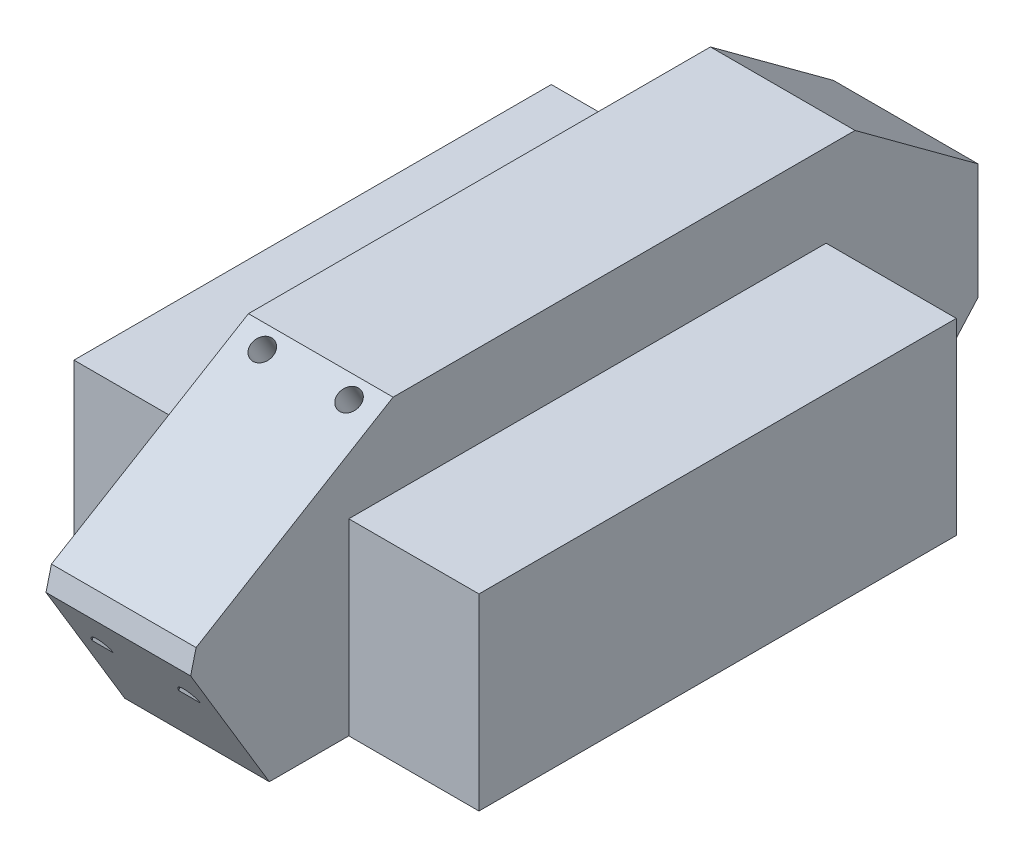
ISO-10303-21;
HEADER;
FILE_DESCRIPTION(('STEP AP214'),'2;1');
FILE_NAME('part.step','',(''),(''),'','','');
FILE_SCHEMA(('AUTOMOTIVE_DESIGN { 1 0 10303 214 1 1 1 1 }'));
ENDSEC;
DATA;
#1=APPLICATION_CONTEXT('core data for automotive mechanical design processes');
#2=APPLICATION_PROTOCOL_DEFINITION('international standard','automotive_design',2000,#1);
#3=PRODUCT_CONTEXT('',#1,'mechanical');
#4=PRODUCT('Part','Part','',(#3));
#5=PRODUCT_RELATED_PRODUCT_CATEGORY('part','',(#4));
#6=PRODUCT_DEFINITION_FORMATION('','',#4);
#7=PRODUCT_DEFINITION_CONTEXT('part definition',#1,'design');
#8=PRODUCT_DEFINITION('design','',#6,#7);
#9=PRODUCT_DEFINITION_SHAPE('','',#8);
#10=(LENGTH_UNIT() NAMED_UNIT(*) SI_UNIT(.MILLI.,.METRE.));
#11=(NAMED_UNIT(*) PLANE_ANGLE_UNIT() SI_UNIT($,.RADIAN.));
#12=(NAMED_UNIT(*) SI_UNIT($,.STERADIAN.) SOLID_ANGLE_UNIT());
#13=UNCERTAINTY_MEASURE_WITH_UNIT(LENGTH_MEASURE(1.E-05),#10,'distance_accuracy_value','');
#14=(GEOMETRIC_REPRESENTATION_CONTEXT(3) GLOBAL_UNCERTAINTY_ASSIGNED_CONTEXT((#13)) GLOBAL_UNIT_ASSIGNED_CONTEXT((#10,
#11,#12)) REPRESENTATION_CONTEXT('',''));
#15=CARTESIAN_POINT('',(0.,0.,0.));
#16=DIRECTION('',(0.,0.,1.));
#17=DIRECTION('',(1.,0.,0.));
#18=AXIS2_PLACEMENT_3D('',#15,#16,#17);
#19=CARTESIAN_POINT('',(-10.,38.,55.));
#20=DIRECTION('',(1.,0.,0.));
#21=DIRECTION('',(0.,0.,-1.));
#22=AXIS2_PLACEMENT_3D('',#19,#20,#21);
#23=PLANE('',#22);
#24=DIRECTION('',(0.,0.857167300702112,0.515038074910055));
#25=VECTOR('',#24,1.);
#26=CARTESIAN_POINT('',(-10.,33.225244065073,62.9465283357303));
#27=LINE('',#26,#25);
#28=CARTESIAN_POINT('',(-10.,0.,42.9827876194488));
#29=VERTEX_POINT('',#28);
#30=CARTESIAN_POINT('',(-10.,18.1142319384553,53.8669162351978));
#31=VERTEX_POINT('',#30);
#32=EDGE_CURVE('E162',#29,#31,#27,.T.);
#33=ORIENTED_EDGE('',*,*,#32,.T.);
#34=DIRECTION('',(0.,0.970295726275997,-0.241921895599667));
#35=VECTOR('',#34,1.);
#36=CARTESIAN_POINT('',(-10.,21.1330837648021,53.1142319384553));
#37=LINE('',#36,#35);
#38=CARTESIAN_POINT('',(-10.,21.1330837648021,53.1142319384553));
#39=VERTEX_POINT('',#38);
#40=EDGE_CURVE('E12',#31,#39,#37,.T.);
#41=ORIENTED_EDGE('',*,*,#40,.T.);
#42=DIRECTION('',(0.,0.515038074910052,-0.857167300702114));
#43=VECTOR('',#42,1.);
#44=CARTESIAN_POINT('',(-10.,38.9757744314794,23.4190079519771));
#45=LINE('',#44,#43);
#46=CARTESIAN_POINT('',(-10.,37.5,25.8751090588658));
#47=VERTEX_POINT('',#46);
#48=EDGE_CURVE('E209',#39,#47,#45,.T.);
#49=ORIENTED_EDGE('',*,*,#48,.T.);
#50=DIRECTION('',(0.,0.,-1.));
#51=VECTOR('',#50,1.);
#52=CARTESIAN_POINT('',(-10.,37.5,55.));
#53=LINE('',#52,#51);
#54=CARTESIAN_POINT('',(-10.,37.5,-38.));
#55=VERTEX_POINT('',#54);
#56=EDGE_CURVE('E334',#47,#55,#53,.T.);
#57=ORIENTED_EDGE('',*,*,#56,.T.);
#58=DIRECTION('',(0.,0.592390450477519,0.805651012649424));
#59=VECTOR('',#58,1.);
#60=CARTESIAN_POINT('',(-10.,82.0606400898372,22.6024705221784));
#61=LINE('',#60,#59);
#62=CARTESIAN_POINT('',(-10.,25.,-55.));
#63=VERTEX_POINT('',#62);
#64=EDGE_CURVE('E310',#63,#55,#61,.T.);
#65=ORIENTED_EDGE('',*,*,#64,.F.);
#66=DIRECTION('',(0.,-1.,0.));
#67=VECTOR('',#66,1.);
#68=CARTESIAN_POINT('',(-10.,38.,-55.));
#69=LINE('',#68,#67);
#70=CARTESIAN_POINT('',(-10.,9.,-55.));
#71=VERTEX_POINT('',#70);
#72=EDGE_CURVE('E177',#63,#71,#69,.T.);
#73=ORIENTED_EDGE('',*,*,#72,.T.);
#74=DIRECTION('',(0.,-0.74740931868366,0.66436383882992));
#75=VECTOR('',#74,1.);
#76=CARTESIAN_POINT('',(-10.,-29.4206896551724,-20.848275862069));
#77=LINE('',#76,#75);
#78=CARTESIAN_POINT('',(-10.,0.,-47.));
#79=VERTEX_POINT('',#78);
#80=EDGE_CURVE('E313',#71,#79,#77,.T.);
#81=ORIENTED_EDGE('',*,*,#80,.T.);
#82=DIRECTION('',(0.,0.,1.));
#83=VECTOR('',#82,1.);
#84=CARTESIAN_POINT('',(-10.,0.,55.));
#85=LINE('',#84,#83);
#86=CARTESIAN_POINT('',(-10.,0.,-34.));
#87=VERTEX_POINT('',#86);
#88=EDGE_CURVE('E184',#79,#87,#85,.T.);
#89=ORIENTED_EDGE('',*,*,#88,.T.);
#90=DIRECTION('',(0.,-1.,0.));
#91=VECTOR('',#90,1.);
#92=CARTESIAN_POINT('',(-10.,26.,-34.));
#93=LINE('',#92,#91);
#94=CARTESIAN_POINT('',(-10.,26.,-34.));
#95=VERTEX_POINT('',#94);
#96=EDGE_CURVE('E218',#95,#87,#93,.T.);
#97=ORIENTED_EDGE('',*,*,#96,.F.);
#98=DIRECTION('',(0.,0.,-1.));
#99=VECTOR('',#98,1.);
#100=CARTESIAN_POINT('',(-10.,26.,86.6227766016838));
#101=LINE('',#100,#99);
#102=CARTESIAN_POINT('',(-10.,26.,32.));
#103=VERTEX_POINT('',#102);
#104=EDGE_CURVE('E248',#103,#95,#101,.T.);
#105=ORIENTED_EDGE('',*,*,#104,.F.);
#106=DIRECTION('',(0.,-1.,0.));
#107=VECTOR('',#106,1.);
#108=CARTESIAN_POINT('',(-10.,26.,32.));
#109=LINE('',#108,#107);
#110=CARTESIAN_POINT('',(-10.,0.,32.));
#111=VERTEX_POINT('',#110);
#112=EDGE_CURVE('E237',#103,#111,#109,.T.);
#113=ORIENTED_EDGE('',*,*,#112,.T.);
#114=EDGE_CURVE('E274',#111,#29,#85,.T.);
#115=ORIENTED_EDGE('',*,*,#114,.T.);
#116=EDGE_LOOP('',(#33,#41,#49,#57,#65,#73,#81,#89,#97,#105,#113,#115));
#117=FACE_BOUND('',#116,.T.);
#118=ADVANCED_FACE('F37',(#117),#23,.F.);
#119=CARTESIAN_POINT('',(10.,38.,55.));
#120=DIRECTION('',(-1.,0.,0.));
#121=DIRECTION('',(0.,0.,1.));
#122=AXIS2_PLACEMENT_3D('',#119,#120,#121);
#123=PLANE('',#122);
#124=DIRECTION('',(0.,-0.515038074910052,0.857167300702114));
#125=VECTOR('',#124,1.);
#126=CARTESIAN_POINT('',(10.,38.9757744314794,23.4190079519771));
#127=LINE('',#126,#125);
#128=CARTESIAN_POINT('',(10.,37.5,25.8751090588657));
#129=VERTEX_POINT('',#128);
#130=CARTESIAN_POINT('',(10.,21.1330837648021,53.1142319384553));
#131=VERTEX_POINT('',#130);
#132=EDGE_CURVE('E208',#129,#131,#127,.T.);
#133=ORIENTED_EDGE('',*,*,#132,.T.);
#134=DIRECTION('',(0.,-0.970295726275997,0.241921895599667));
#135=VECTOR('',#134,1.);
#136=CARTESIAN_POINT('',(10.,21.1330837648021,53.1142319384553));
#137=LINE('',#136,#135);
#138=CARTESIAN_POINT('',(10.,18.1142319384553,53.8669162351979));
#139=VERTEX_POINT('',#138);
#140=EDGE_CURVE('E59',#131,#139,#137,.T.);
#141=ORIENTED_EDGE('',*,*,#140,.T.);
#142=DIRECTION('',(0.,0.857167300702112,0.515038074910055));
#143=VECTOR('',#142,1.);
#144=CARTESIAN_POINT('',(10.,20.,55.));
#145=LINE('',#144,#143);
#146=CARTESIAN_POINT('',(10.,0.,42.9827876194488));
#147=VERTEX_POINT('',#146);
#148=EDGE_CURVE('E161',#147,#139,#145,.T.);
#149=ORIENTED_EDGE('',*,*,#148,.F.);
#150=DIRECTION('',(0.,0.,-1.));
#151=VECTOR('',#150,1.);
#152=CARTESIAN_POINT('',(10.,0.,55.));
#153=LINE('',#152,#151);
#154=CARTESIAN_POINT('',(10.,0.,32.));
#155=VERTEX_POINT('',#154);
#156=EDGE_CURVE('E170',#147,#155,#153,.T.);
#157=ORIENTED_EDGE('',*,*,#156,.T.);
#158=DIRECTION('',(0.,1.,0.));
#159=VECTOR('',#158,1.);
#160=CARTESIAN_POINT('',(10.,26.,32.));
#161=LINE('',#160,#159);
#162=CARTESIAN_POINT('',(10.,26.,32.));
#163=VERTEX_POINT('',#162);
#164=EDGE_CURVE('E268',#155,#163,#161,.T.);
#165=ORIENTED_EDGE('',*,*,#164,.T.);
#166=DIRECTION('',(0.,0.,-1.));
#167=VECTOR('',#166,1.);
#168=CARTESIAN_POINT('',(10.,26.,86.6227766016838));
#169=LINE('',#168,#167);
#170=CARTESIAN_POINT('',(10.,26.,-34.));
#171=VERTEX_POINT('',#170);
#172=EDGE_CURVE('E278',#163,#171,#169,.T.);
#173=ORIENTED_EDGE('',*,*,#172,.T.);
#174=DIRECTION('',(0.,1.,0.));
#175=VECTOR('',#174,1.);
#176=CARTESIAN_POINT('',(10.,26.,-34.));
#177=LINE('',#176,#175);
#178=CARTESIAN_POINT('',(10.,0.,-34.));
#179=VERTEX_POINT('',#178);
#180=EDGE_CURVE('E263',#179,#171,#177,.T.);
#181=ORIENTED_EDGE('',*,*,#180,.F.);
#182=CARTESIAN_POINT('',(10.,0.,-47.));
#183=VERTEX_POINT('',#182);
#184=EDGE_CURVE('E178',#179,#183,#153,.T.);
#185=ORIENTED_EDGE('',*,*,#184,.T.);
#186=DIRECTION('',(0.,-0.74740931868366,0.66436383882992));
#187=VECTOR('',#186,1.);
#188=CARTESIAN_POINT('',(10.,-23.3379310344828,-26.2551724137931));
#189=LINE('',#188,#187);
#190=CARTESIAN_POINT('',(10.,9.,-55.));
#191=VERTEX_POINT('',#190);
#192=EDGE_CURVE('E298',#191,#183,#189,.T.);
#193=ORIENTED_EDGE('',*,*,#192,.F.);
#194=DIRECTION('',(0.,-1.,0.));
#195=VECTOR('',#194,1.);
#196=CARTESIAN_POINT('',(10.,38.,-55.));
#197=LINE('',#196,#195);
#198=CARTESIAN_POINT('',(10.,25.,-55.));
#199=VERTEX_POINT('',#198);
#200=EDGE_CURVE('E181',#199,#191,#197,.T.);
#201=ORIENTED_EDGE('',*,*,#200,.F.);
#202=DIRECTION('',(0.,0.592390450477519,0.805651012649424));
#203=VECTOR('',#202,1.);
#204=CARTESIAN_POINT('',(10.,42.4761370016844,-31.2324536777092));
#205=LINE('',#204,#203);
#206=CARTESIAN_POINT('',(10.,37.5,-38.));
#207=VERTEX_POINT('',#206);
#208=EDGE_CURVE('E311',#199,#207,#205,.T.);
#209=ORIENTED_EDGE('',*,*,#208,.T.);
#210=DIRECTION('',(0.,0.,-1.));
#211=VECTOR('',#210,1.);
#212=CARTESIAN_POINT('',(10.,37.5,-58.4735309930156));
#213=LINE('',#212,#211);
#214=EDGE_CURVE('E215',#129,#207,#213,.T.);
#215=ORIENTED_EDGE('',*,*,#214,.F.);
#216=EDGE_LOOP('',(#133,#141,#149,#157,#165,#173,#181,#185,#193,#201,#209,#215));
#217=FACE_BOUND('',#216,.T.);
#218=ADVANCED_FACE('F169',(#217),#123,.F.);
#219=CARTESIAN_POINT('',(10.,38.,-55.));
#220=DIRECTION('',(0.,0.,1.));
#221=DIRECTION('',(1.,0.,0.));
#222=AXIS2_PLACEMENT_3D('',#219,#220,#221);
#223=PLANE('',#222);
#224=DIRECTION('',(1.,0.,0.));
#225=VECTOR('',#224,1.);
#226=CARTESIAN_POINT('',(-28.,25.,-55.));
#227=LINE('',#226,#225);
#228=EDGE_CURVE('E307',#63,#199,#227,.T.);
#229=ORIENTED_EDGE('',*,*,#228,.T.);
#230=ORIENTED_EDGE('',*,*,#200,.T.);
#231=DIRECTION('',(1.,0.,0.));
#232=VECTOR('',#231,1.);
#233=CARTESIAN_POINT('',(-28.,9.,-55.));
#234=LINE('',#233,#232);
#235=EDGE_CURVE('E300',#71,#191,#234,.T.);
#236=ORIENTED_EDGE('',*,*,#235,.F.);
#237=ORIENTED_EDGE('',*,*,#72,.F.);
#238=EDGE_LOOP('',(#229,#230,#236,#237));
#239=FACE_BOUND('',#238,.T.);
#240=ADVANCED_FACE('F305',(#239),#223,.F.);
#241=CARTESIAN_POINT('',(-28.,37.5,-58.4735309930156));
#242=DIRECTION('',(0.,-1.,0.));
#243=DIRECTION('',(0.,0.,-1.));
#244=AXIS2_PLACEMENT_3D('',#241,#242,#243);
#245=PLANE('',#244);
#246=DIRECTION('',(1.,0.,0.));
#247=VECTOR('',#246,1.);
#248=CARTESIAN_POINT('',(-28.,37.5,-38.));
#249=LINE('',#248,#247);
#250=EDGE_CURVE('E192',#55,#207,#249,.T.);
#251=ORIENTED_EDGE('',*,*,#250,.F.);
#252=ORIENTED_EDGE('',*,*,#56,.F.);
#253=DIRECTION('',(1.,0.,0.));
#254=VECTOR('',#253,1.);
#255=CARTESIAN_POINT('',(-44.9488724753866,37.5,25.8751090588658));
#256=LINE('',#255,#254);
#257=EDGE_CURVE('E190',#47,#129,#256,.T.);
#258=ORIENTED_EDGE('',*,*,#257,.T.);
#259=ORIENTED_EDGE('',*,*,#214,.T.);
#260=EDGE_LOOP('',(#251,#252,#258,#259));
#261=FACE_BOUND('',#260,.T.);
#262=ADVANCED_FACE('F378',(#261),#245,.F.);
#263=CARTESIAN_POINT('',(0.,0.,0.));
#264=DIRECTION('',(0.,1.,0.));
#265=DIRECTION('',(0.,0.,1.));
#266=AXIS2_PLACEMENT_3D('',#263,#264,#265);
#267=PLANE('',#266);
#268=ORIENTED_EDGE('',*,*,#156,.F.);
#269=DIRECTION('',(1.,0.,0.));
#270=VECTOR('',#269,1.);
#271=CARTESIAN_POINT('',(-28.,0.,42.9827876194488));
#272=LINE('',#271,#270);
#273=EDGE_CURVE('E159',#29,#147,#272,.T.);
#274=ORIENTED_EDGE('',*,*,#273,.F.);
#275=ORIENTED_EDGE('',*,*,#114,.F.);
#276=DIRECTION('',(-1.,0.,0.));
#277=VECTOR('',#276,1.);
#278=CARTESIAN_POINT('',(-28.,0.,32.));
#279=LINE('',#278,#277);
#280=CARTESIAN_POINT('',(-28.,0.,32.));
#281=VERTEX_POINT('',#280);
#282=EDGE_CURVE('E239',#111,#281,#279,.T.);
#283=ORIENTED_EDGE('',*,*,#282,.T.);
#284=DIRECTION('',(0.,0.,-1.));
#285=VECTOR('',#284,1.);
#286=CARTESIAN_POINT('',(-28.,0.,86.6227766016838));
#287=LINE('',#286,#285);
#288=CARTESIAN_POINT('',(-28.,0.,-34.));
#289=VERTEX_POINT('',#288);
#290=EDGE_CURVE('E251',#281,#289,#287,.T.);
#291=ORIENTED_EDGE('',*,*,#290,.T.);
#292=DIRECTION('',(-1.,0.,0.));
#293=VECTOR('',#292,1.);
#294=CARTESIAN_POINT('',(-28.,0.,-34.));
#295=LINE('',#294,#293);
#296=EDGE_CURVE('E233',#87,#289,#295,.T.);
#297=ORIENTED_EDGE('',*,*,#296,.F.);
#298=ORIENTED_EDGE('',*,*,#88,.F.);
#299=DIRECTION('',(1.,0.,0.));
#300=VECTOR('',#299,1.);
#301=CARTESIAN_POINT('',(0.,0.,-47.));
#302=LINE('',#301,#300);
#303=EDGE_CURVE('E194',#79,#183,#302,.T.);
#304=ORIENTED_EDGE('',*,*,#303,.T.);
#305=ORIENTED_EDGE('',*,*,#184,.F.);
#306=DIRECTION('',(-1.,0.,0.));
#307=VECTOR('',#306,1.);
#308=CARTESIAN_POINT('',(28.,0.,-34.));
#309=LINE('',#308,#307);
#310=CARTESIAN_POINT('',(28.,0.,-34.));
#311=VERTEX_POINT('',#310);
#312=EDGE_CURVE('E246',#311,#179,#309,.T.);
#313=ORIENTED_EDGE('',*,*,#312,.F.);
#314=DIRECTION('',(0.,0.,-1.));
#315=VECTOR('',#314,1.);
#316=CARTESIAN_POINT('',(28.,0.,86.6227766016838));
#317=LINE('',#316,#315);
#318=CARTESIAN_POINT('',(28.,0.,32.));
#319=VERTEX_POINT('',#318);
#320=EDGE_CURVE('E276',#319,#311,#317,.T.);
#321=ORIENTED_EDGE('',*,*,#320,.F.);
#322=DIRECTION('',(-1.,0.,0.));
#323=VECTOR('',#322,1.);
#324=CARTESIAN_POINT('',(28.,0.,32.));
#325=LINE('',#324,#323);
#326=EDGE_CURVE('E176',#319,#155,#325,.T.);
#327=ORIENTED_EDGE('',*,*,#326,.T.);
#328=EDGE_LOOP('',(#268,#274,#275,#283,#291,#297,#298,#304,#305,#313,#321,#327));
#329=FACE_BOUND('',#328,.T.);
#330=ADVANCED_FACE('F174',(#329),#267,.F.);
#331=CARTESIAN_POINT('',(28.,26.,86.6227766016838));
#332=DIRECTION('',(-1.,0.,0.));
#333=DIRECTION('',(0.,-1.,0.));
#334=AXIS2_PLACEMENT_3D('',#331,#332,#333);
#335=PLANE('',#334);
#336=DIRECTION('',(0.,0.,-1.));
#337=VECTOR('',#336,1.);
#338=CARTESIAN_POINT('',(28.,26.,86.6227766016838));
#339=LINE('',#338,#337);
#340=CARTESIAN_POINT('',(28.,26.,32.));
#341=VERTEX_POINT('',#340);
#342=CARTESIAN_POINT('',(28.,26.,-34.));
#343=VERTEX_POINT('',#342);
#344=EDGE_CURVE('E266',#341,#343,#339,.T.);
#345=ORIENTED_EDGE('',*,*,#344,.F.);
#346=DIRECTION('',(0.,-1.,0.));
#347=VECTOR('',#346,1.);
#348=CARTESIAN_POINT('',(28.,26.,32.));
#349=LINE('',#348,#347);
#350=EDGE_CURVE('E269',#341,#319,#349,.T.);
#351=ORIENTED_EDGE('',*,*,#350,.T.);
#352=ORIENTED_EDGE('',*,*,#320,.T.);
#353=DIRECTION('',(0.,-1.,0.));
#354=VECTOR('',#353,1.);
#355=CARTESIAN_POINT('',(28.,26.,-34.));
#356=LINE('',#355,#354);
#357=EDGE_CURVE('E257',#343,#311,#356,.T.);
#358=ORIENTED_EDGE('',*,*,#357,.F.);
#359=EDGE_LOOP('',(#345,#351,#352,#358));
#360=FACE_BOUND('',#359,.T.);
#361=ADVANCED_FACE('F282',(#360),#335,.F.);
#362=CARTESIAN_POINT('',(10.,26.,86.6227766016838));
#363=DIRECTION('',(0.,-1.,0.));
#364=DIRECTION('',(0.,0.,-1.));
#365=AXIS2_PLACEMENT_3D('',#362,#363,#364);
#366=PLANE('',#365);
#367=ORIENTED_EDGE('',*,*,#172,.F.);
#368=DIRECTION('',(1.,0.,0.));
#369=VECTOR('',#368,1.);
#370=CARTESIAN_POINT('',(9.99999999999998,26.,32.));
#371=LINE('',#370,#369);
#372=EDGE_CURVE('E271',#163,#341,#371,.T.);
#373=ORIENTED_EDGE('',*,*,#372,.T.);
#374=ORIENTED_EDGE('',*,*,#344,.T.);
#375=DIRECTION('',(1.,0.,0.));
#376=VECTOR('',#375,1.);
#377=CARTESIAN_POINT('',(10.,26.,-34.));
#378=LINE('',#377,#376);
#379=EDGE_CURVE('E260',#171,#343,#378,.T.);
#380=ORIENTED_EDGE('',*,*,#379,.F.);
#381=EDGE_LOOP('',(#367,#373,#374,#380));
#382=FACE_BOUND('',#381,.T.);
#383=ADVANCED_FACE('F289',(#382),#366,.F.);
#384=CARTESIAN_POINT('',(9.99999999999999,38.,32.));
#385=DIRECTION('',(0.,0.,-1.));
#386=DIRECTION('',(-1.,0.,0.));
#387=AXIS2_PLACEMENT_3D('',#384,#385,#386);
#388=PLANE('',#387);
#389=ORIENTED_EDGE('',*,*,#164,.F.);
#390=ORIENTED_EDGE('',*,*,#326,.F.);
#391=ORIENTED_EDGE('',*,*,#350,.F.);
#392=ORIENTED_EDGE('',*,*,#372,.F.);
#393=EDGE_LOOP('',(#389,#390,#391,#392));
#394=FACE_BOUND('',#393,.T.);
#395=ADVANCED_FACE('F286',(#394),#388,.F.);
#396=CARTESIAN_POINT('',(10.,38.,-34.));
#397=DIRECTION('',(0.,0.,1.));
#398=DIRECTION('',(1.,0.,0.));
#399=AXIS2_PLACEMENT_3D('',#396,#397,#398);
#400=PLANE('',#399);
#401=ORIENTED_EDGE('',*,*,#379,.T.);
#402=ORIENTED_EDGE('',*,*,#357,.T.);
#403=ORIENTED_EDGE('',*,*,#312,.T.);
#404=ORIENTED_EDGE('',*,*,#180,.T.);
#405=EDGE_LOOP('',(#401,#402,#403,#404));
#406=FACE_BOUND('',#405,.T.);
#407=ADVANCED_FACE('F293',(#406),#400,.F.);
#408=CARTESIAN_POINT('',(-10.,26.,86.6227766016838));
#409=DIRECTION('',(0.,-1.,0.));
#410=DIRECTION('',(0.,0.,-1.));
#411=AXIS2_PLACEMENT_3D('',#408,#409,#410);
#412=PLANE('',#411);
#413=DIRECTION('',(0.,0.,-1.));
#414=VECTOR('',#413,1.);
#415=CARTESIAN_POINT('',(-28.,26.,86.6227766016838));
#416=LINE('',#415,#414);
#417=CARTESIAN_POINT('',(-28.,26.,32.));
#418=VERTEX_POINT('',#417);
#419=CARTESIAN_POINT('',(-28.,26.,-34.));
#420=VERTEX_POINT('',#419);
#421=EDGE_CURVE('E236',#418,#420,#416,.T.);
#422=ORIENTED_EDGE('',*,*,#421,.F.);
#423=DIRECTION('',(1.,0.,0.));
#424=VECTOR('',#423,1.);
#425=CARTESIAN_POINT('',(-10.,26.,32.));
#426=LINE('',#425,#424);
#427=EDGE_CURVE('E240',#418,#103,#426,.T.);
#428=ORIENTED_EDGE('',*,*,#427,.T.);
#429=ORIENTED_EDGE('',*,*,#104,.T.);
#430=DIRECTION('',(1.,0.,0.));
#431=VECTOR('',#430,1.);
#432=CARTESIAN_POINT('',(-9.99999999999998,26.,-34.));
#433=LINE('',#432,#431);
#434=EDGE_CURVE('E227',#420,#95,#433,.T.);
#435=ORIENTED_EDGE('',*,*,#434,.F.);
#436=EDGE_LOOP('',(#422,#428,#429,#435));
#437=FACE_BOUND('',#436,.T.);
#438=ADVANCED_FACE('F389',(#437),#412,.F.);
#439=CARTESIAN_POINT('',(-28.,26.,86.6227766016838));
#440=DIRECTION('',(1.,0.,0.));
#441=DIRECTION('',(0.,1.,0.));
#442=AXIS2_PLACEMENT_3D('',#439,#440,#441);
#443=PLANE('',#442);
#444=ORIENTED_EDGE('',*,*,#290,.F.);
#445=DIRECTION('',(0.,1.,0.));
#446=VECTOR('',#445,1.);
#447=CARTESIAN_POINT('',(-28.,26.,32.));
#448=LINE('',#447,#446);
#449=EDGE_CURVE('E243',#281,#418,#448,.T.);
#450=ORIENTED_EDGE('',*,*,#449,.T.);
#451=ORIENTED_EDGE('',*,*,#421,.T.);
#452=DIRECTION('',(0.,1.,0.));
#453=VECTOR('',#452,1.);
#454=CARTESIAN_POINT('',(-28.,26.,-34.));
#455=LINE('',#454,#453);
#456=EDGE_CURVE('E230',#289,#420,#455,.T.);
#457=ORIENTED_EDGE('',*,*,#456,.F.);
#458=EDGE_LOOP('',(#444,#450,#451,#457));
#459=FACE_BOUND('',#458,.T.);
#460=ADVANCED_FACE('F390',(#459),#443,.F.);
#461=CARTESIAN_POINT('',(9.99999999999999,38.,32.));
#462=DIRECTION('',(0.,0.,-1.));
#463=DIRECTION('',(-1.,0.,0.));
#464=AXIS2_PLACEMENT_3D('',#461,#462,#463);
#465=PLANE('',#464);
#466=ORIENTED_EDGE('',*,*,#282,.F.);
#467=ORIENTED_EDGE('',*,*,#112,.F.);
#468=ORIENTED_EDGE('',*,*,#427,.F.);
#469=ORIENTED_EDGE('',*,*,#449,.F.);
#470=EDGE_LOOP('',(#466,#467,#468,#469));
#471=FACE_BOUND('',#470,.T.);
#472=ADVANCED_FACE('F393',(#471),#465,.F.);
#473=CARTESIAN_POINT('',(10.,38.,-34.));
#474=DIRECTION('',(0.,0.,1.));
#475=DIRECTION('',(1.,0.,0.));
#476=AXIS2_PLACEMENT_3D('',#473,#474,#475);
#477=PLANE('',#476);
#478=ORIENTED_EDGE('',*,*,#456,.T.);
#479=ORIENTED_EDGE('',*,*,#434,.T.);
#480=ORIENTED_EDGE('',*,*,#96,.T.);
#481=ORIENTED_EDGE('',*,*,#296,.T.);
#482=EDGE_LOOP('',(#478,#479,#480,#481));
#483=FACE_BOUND('',#482,.T.);
#484=ADVANCED_FACE('F400',(#483),#477,.F.);
#485=CARTESIAN_POINT('',(-44.9488724753866,38.9757744314794,23.4190079519771));
#486=DIRECTION('',(0.,0.857167300702113,0.515038074910052));
#487=DIRECTION('',(0.,-0.515038074910052,0.857167300702114));
#488=AXIS2_PLACEMENT_3D('',#485,#486,#487);
#489=PLANE('',#488);
#490=CARTESIAN_POINT('',(-6.,36.2433070972195,27.9665972725789));
#491=DIRECTION('',(0.,0.857167300702113,0.515038074910052));
#492=DIRECTION('',(0.,-0.515038074910052,0.857167300702113));
#493=AXIS2_PLACEMENT_3D('',#490,#491,#492);
#494=CIRCLE('',#493,1.5);
#495=CARTESIAN_POINT('',(-6.,35.4707499848544,29.2523482236321));
#496=VERTEX_POINT('',#495);
#497=EDGE_CURVE('E325',#496,#496,#494,.T.);
#498=ORIENTED_EDGE('',*,*,#497,.F.);
#499=EDGE_LOOP('',(#498));
#500=FACE_BOUND('',#499,.T.);
#501=CARTESIAN_POINT('',(6.,36.2433070972195,27.9665972725789));
#502=DIRECTION('',(0.,0.857167300702113,0.515038074910052));
#503=DIRECTION('',(0.,0.515038074910052,-0.857167300702113));
#504=AXIS2_PLACEMENT_3D('',#501,#502,#503);
#505=CIRCLE('',#504,1.5);
#506=CARTESIAN_POINT('',(6.,37.0158642095846,26.6808463215258));
#507=VERTEX_POINT('',#506);
#508=EDGE_CURVE('E321',#507,#507,#505,.T.);
#509=ORIENTED_EDGE('',*,*,#508,.F.);
#510=EDGE_LOOP('',(#509));
#511=FACE_BOUND('',#510,.T.);
#512=ORIENTED_EDGE('',*,*,#48,.F.);
#513=DIRECTION('',(1.,0.,0.));
#514=VECTOR('',#513,1.);
#515=CARTESIAN_POINT('',(10.,21.1330837648021,53.1142319384553));
#516=LINE('',#515,#514);
#517=EDGE_CURVE('E199',#39,#131,#516,.T.);
#518=ORIENTED_EDGE('',*,*,#517,.T.);
#519=ORIENTED_EDGE('',*,*,#132,.F.);
#520=ORIENTED_EDGE('',*,*,#257,.F.);
#521=EDGE_LOOP('',(#512,#518,#519,#520));
#522=FACE_BOUND('',#521,.T.);
#523=ADVANCED_FACE('F206',(#500,#511,#522),#489,.T.);
#524=CARTESIAN_POINT('',(6.,31.9574705937089,25.3914068980287));
#525=DIRECTION('',(0.,0.857167300702113,0.515038074910052));
#526=DIRECTION('',(0.,-0.515038074910052,0.857167300702114));
#527=AXIS2_PLACEMENT_3D('',#524,#525,#526);
#528=CYLINDRICAL_SURFACE('',#527,1.5);
#529=CARTESIAN_POINT('',(6.,31.9574705937089,25.3914068980287));
#530=DIRECTION('',(0.,0.857167300702113,0.515038074910052));
#531=DIRECTION('',(0.,0.515038074910052,-0.857167300702113));
#532=AXIS2_PLACEMENT_3D('',#529,#530,#531);
#533=CIRCLE('',#532,1.5);
#534=CARTESIAN_POINT('',(6.,32.730027706074,24.1056559469755));
#535=VERTEX_POINT('',#534);
#536=EDGE_CURVE('E328',#535,#535,#533,.T.);
#537=ORIENTED_EDGE('',*,*,#536,.F.);
#538=EDGE_LOOP('',(#537));
#539=FACE_BOUND('',#538,.T.);
#540=ORIENTED_EDGE('',*,*,#508,.T.);
#541=EDGE_LOOP('',(#540));
#542=FACE_BOUND('',#541,.T.);
#543=ADVANCED_FACE('F407',(#539,#542),#528,.F.);
#544=CARTESIAN_POINT('',(6.,31.9574705937089,25.3914068980287));
#545=DIRECTION('',(0.,-0.857167300702113,-0.515038074910052));
#546=DIRECTION('',(0.,0.515038074910052,-0.857167300702113));
#547=AXIS2_PLACEMENT_3D('',#544,#545,#546);
#548=PLANE('',#547);
#549=ORIENTED_EDGE('',*,*,#536,.T.);
#550=EDGE_LOOP('',(#549));
#551=FACE_BOUND('',#550,.T.);
#552=ADVANCED_FACE('F420',(#551),#548,.F.);
#553=CARTESIAN_POINT('',(-6.,31.9574705937089,25.3914068980287));
#554=DIRECTION('',(0.,0.857167300702113,0.515038074910052));
#555=DIRECTION('',(0.,-0.515038074910052,0.857167300702114));
#556=AXIS2_PLACEMENT_3D('',#553,#554,#555);
#557=CYLINDRICAL_SURFACE('',#556,1.5);
#558=CARTESIAN_POINT('',(-6.,31.9574705937089,25.3914068980287));
#559=DIRECTION('',(0.,0.857167300702113,0.515038074910052));
#560=DIRECTION('',(0.,-0.515038074910052,0.857167300702113));
#561=AXIS2_PLACEMENT_3D('',#558,#559,#560);
#562=CIRCLE('',#561,1.5);
#563=CARTESIAN_POINT('',(-6.,31.1849134813439,26.6771578490818));
#564=VERTEX_POINT('',#563);
#565=EDGE_CURVE('E322',#564,#564,#562,.T.);
#566=ORIENTED_EDGE('',*,*,#565,.F.);
#567=EDGE_LOOP('',(#566));
#568=FACE_BOUND('',#567,.T.);
#569=ORIENTED_EDGE('',*,*,#497,.T.);
#570=EDGE_LOOP('',(#569));
#571=FACE_BOUND('',#570,.T.);
#572=ADVANCED_FACE('F424',(#568,#571),#557,.F.);
#573=CARTESIAN_POINT('',(-6.,31.9574705937089,25.3914068980287));
#574=DIRECTION('',(0.,0.857167300702113,0.515038074910052));
#575=DIRECTION('',(0.,-0.515038074910052,0.857167300702113));
#576=AXIS2_PLACEMENT_3D('',#573,#574,#575);
#577=PLANE('',#576);
#578=ORIENTED_EDGE('',*,*,#565,.T.);
#579=EDGE_LOOP('',(#578));
#580=FACE_BOUND('',#579,.T.);
#581=ADVANCED_FACE('F428',(#580),#577,.T.);
#582=CARTESIAN_POINT('',(-28.,42.4761370016844,-31.2324536777092));
#583=DIRECTION('',(0.,0.805651012649424,-0.592390450477519));
#584=DIRECTION('',(0.,0.592390450477519,0.805651012649424));
#585=AXIS2_PLACEMENT_3D('',#582,#583,#584);
#586=PLANE('',#585);
#587=ORIENTED_EDGE('',*,*,#64,.T.);
#588=ORIENTED_EDGE('',*,*,#250,.T.);
#589=ORIENTED_EDGE('',*,*,#208,.F.);
#590=ORIENTED_EDGE('',*,*,#228,.F.);
#591=EDGE_LOOP('',(#587,#588,#589,#590));
#592=FACE_BOUND('',#591,.T.);
#593=ADVANCED_FACE('F366',(#592),#586,.T.);
#594=CARTESIAN_POINT('',(-28.,-23.3379310344828,-26.2551724137931));
#595=DIRECTION('',(0.,0.66436383882992,0.74740931868366));
#596=DIRECTION('',(0.,-0.74740931868366,0.66436383882992));
#597=AXIS2_PLACEMENT_3D('',#594,#595,#596);
#598=PLANE('',#597);
#599=ORIENTED_EDGE('',*,*,#235,.T.);
#600=ORIENTED_EDGE('',*,*,#192,.T.);
#601=ORIENTED_EDGE('',*,*,#303,.F.);
#602=ORIENTED_EDGE('',*,*,#80,.F.);
#603=EDGE_LOOP('',(#599,#600,#601,#602));
#604=FACE_BOUND('',#603,.T.);
#605=ADVANCED_FACE('F359',(#604),#598,.F.);
#606=CARTESIAN_POINT('',(-28.,20.,55.));
#607=DIRECTION('',(0.,0.515038074910055,-0.857167300702112));
#608=DIRECTION('',(0.,0.857167300702112,0.515038074910055));
#609=AXIS2_PLACEMENT_3D('',#606,#607,#608);
#610=PLANE('',#609);
#611=DIRECTION('',(-1.,0.,0.));
#612=VECTOR('',#611,1.);
#613=CARTESIAN_POINT('',(-5.99999999999998,11.6786025882474,50.));
#614=LINE('',#613,#612);
#615=CARTESIAN_POINT('',(-4.51067091767086,11.6786025882474,50.));
#616=VERTEX_POINT('',#615);
#617=CARTESIAN_POINT('',(-7.48932908232911,11.6786025882474,50.));
#618=VERTEX_POINT('',#617);
#619=EDGE_CURVE('E197',#616,#618,#614,.T.);
#620=ORIENTED_EDGE('',*,*,#619,.T.);
#621=CARTESIAN_POINT('',(-5.99999999999998,11.5,49.8926847382657));
#622=DIRECTION('',(0.,0.515038074910055,-0.857167300702112));
#623=DIRECTION('',(0.,0.857167300702112,0.515038074910055));
#624=AXIS2_PLACEMENT_3D('',#621,#622,#623);
#625=ELLIPSE('',#624,1.749950095823,1.5);
#626=EDGE_CURVE('E167',#616,#618,#625,.F.);
#627=ORIENTED_EDGE('',*,*,#626,.F.);
#628=EDGE_LOOP('',(#620,#627));
#629=FACE_BOUND('',#628,.T.);
#630=DIRECTION('',(1.,0.,0.));
#631=VECTOR('',#630,1.);
#632=CARTESIAN_POINT('',(6.00000000000002,11.6786025882474,50.));
#633=LINE('',#632,#631);
#634=CARTESIAN_POINT('',(4.51067091767089,11.6786025882474,50.));
#635=VERTEX_POINT('',#634);
#636=CARTESIAN_POINT('',(7.48932908232914,11.6786025882474,50.));
#637=VERTEX_POINT('',#636);
#638=EDGE_CURVE('E341',#635,#637,#633,.T.);
#639=ORIENTED_EDGE('',*,*,#638,.F.);
#640=CARTESIAN_POINT('',(6.00000000000002,11.5,49.8926847382657));
#641=DIRECTION('',(0.,0.515038074910055,-0.857167300702112));
#642=DIRECTION('',(0.,0.857167300702112,0.515038074910055));
#643=AXIS2_PLACEMENT_3D('',#640,#641,#642);
#644=ELLIPSE('',#643,1.749950095823,1.5);
#645=EDGE_CURVE('E345',#637,#635,#644,.F.);
#646=ORIENTED_EDGE('',*,*,#645,.F.);
#647=EDGE_LOOP('',(#639,#646));
#648=FACE_BOUND('',#647,.T.);
#649=ORIENTED_EDGE('',*,*,#148,.T.);
#650=DIRECTION('',(-1.,0.,0.));
#651=VECTOR('',#650,1.);
#652=CARTESIAN_POINT('',(-10.,18.1142319384553,53.8669162351979));
#653=LINE('',#652,#651);
#654=EDGE_CURVE('E45',#139,#31,#653,.T.);
#655=ORIENTED_EDGE('',*,*,#654,.T.);
#656=ORIENTED_EDGE('',*,*,#32,.F.);
#657=ORIENTED_EDGE('',*,*,#273,.T.);
#658=EDGE_LOOP('',(#649,#655,#656,#657));
#659=FACE_BOUND('',#658,.T.);
#660=ADVANCED_FACE('F160',(#629,#648,#659),#610,.F.);
#661=CARTESIAN_POINT('',(6.00000000000002,11.5,50.));
#662=DIRECTION('',(0.,0.,-1.));
#663=DIRECTION('',(-1.,0.,0.));
#664=AXIS2_PLACEMENT_3D('',#661,#662,#663);
#665=PLANE('',#664);
#666=CARTESIAN_POINT('',(6.00000000000002,11.5,50.));
#667=DIRECTION('',(0.,0.,1.));
#668=DIRECTION('',(-1.,0.,0.));
#669=AXIS2_PLACEMENT_3D('',#666,#667,#668);
#670=CIRCLE('',#669,1.5);
#671=EDGE_CURVE('E221',#637,#635,#670,.T.);
#672=ORIENTED_EDGE('',*,*,#671,.T.);
#673=ORIENTED_EDGE('',*,*,#638,.T.);
#674=EDGE_LOOP('',(#672,#673));
#675=FACE_BOUND('',#674,.T.);
#676=ADVANCED_FACE('F340',(#675),#665,.F.);
#677=CARTESIAN_POINT('',(6.00000000000002,11.5,50.));
#678=DIRECTION('',(0.,0.,1.));
#679=DIRECTION('',(1.,0.,0.));
#680=AXIS2_PLACEMENT_3D('',#677,#678,#679);
#681=CYLINDRICAL_SURFACE('',#680,1.5);
#682=ORIENTED_EDGE('',*,*,#671,.F.);
#683=ORIENTED_EDGE('',*,*,#645,.T.);
#684=EDGE_LOOP('',(#682,#683));
#685=FACE_BOUND('',#684,.T.);
#686=ADVANCED_FACE('F344',(#685),#681,.F.);
#687=CARTESIAN_POINT('',(-5.99999999999998,11.5,50.));
#688=DIRECTION('',(0.,0.,1.));
#689=DIRECTION('',(1.,0.,0.));
#690=AXIS2_PLACEMENT_3D('',#687,#688,#689);
#691=PLANE('',#690);
#692=ORIENTED_EDGE('',*,*,#619,.F.);
#693=CARTESIAN_POINT('',(-5.99999999999998,11.5,50.));
#694=DIRECTION('',(0.,0.,1.));
#695=DIRECTION('',(1.,0.,0.));
#696=AXIS2_PLACEMENT_3D('',#693,#694,#695);
#697=CIRCLE('',#696,1.5);
#698=EDGE_CURVE('E216',#616,#618,#697,.T.);
#699=ORIENTED_EDGE('',*,*,#698,.T.);
#700=EDGE_LOOP('',(#692,#699));
#701=FACE_BOUND('',#700,.T.);
#702=ADVANCED_FACE('F357',(#701),#691,.T.);
#703=CARTESIAN_POINT('',(-5.99999999999998,11.5,50.));
#704=DIRECTION('',(0.,0.,1.));
#705=DIRECTION('',(1.,0.,0.));
#706=AXIS2_PLACEMENT_3D('',#703,#704,#705);
#707=CYLINDRICAL_SURFACE('',#706,1.5);
#708=ORIENTED_EDGE('',*,*,#698,.F.);
#709=ORIENTED_EDGE('',*,*,#626,.T.);
#710=EDGE_LOOP('',(#708,#709));
#711=FACE_BOUND('',#710,.T.);
#712=ADVANCED_FACE('F353',(#711),#707,.F.);
#713=CARTESIAN_POINT('',(-44.9488724753866,21.1330837648021,53.1142319384553));
#714=DIRECTION('',(0.,0.241921895599667,0.970295726275997));
#715=DIRECTION('',(-1.,0.,0.));
#716=AXIS2_PLACEMENT_3D('',#713,#714,#715);
#717=PLANE('',#716);
#718=ORIENTED_EDGE('',*,*,#40,.F.);
#719=ORIENTED_EDGE('',*,*,#654,.F.);
#720=ORIENTED_EDGE('',*,*,#140,.F.);
#721=ORIENTED_EDGE('',*,*,#517,.F.);
#722=EDGE_LOOP('',(#718,#719,#720,#721));
#723=FACE_BOUND('',#722,.T.);
#724=ADVANCED_FACE('F39',(#723),#717,.T.);
#725=CLOSED_SHELL('',(#118,#218,#240,#262,#330,#361,#383,#395,#407,#438,#460,#472,#484,#523,
#543,#552,#572,#581,#593,#605,#660,#676,#686,#702,#712,#724));
#726=MANIFOLD_SOLID_BREP('B2',#725);
#727=ADVANCED_BREP_SHAPE_REPRESENTATION('',(#18,#726),#14);
#728=SHAPE_DEFINITION_REPRESENTATION(#9,#727);
ENDSEC;
END-ISO-10303-21;
